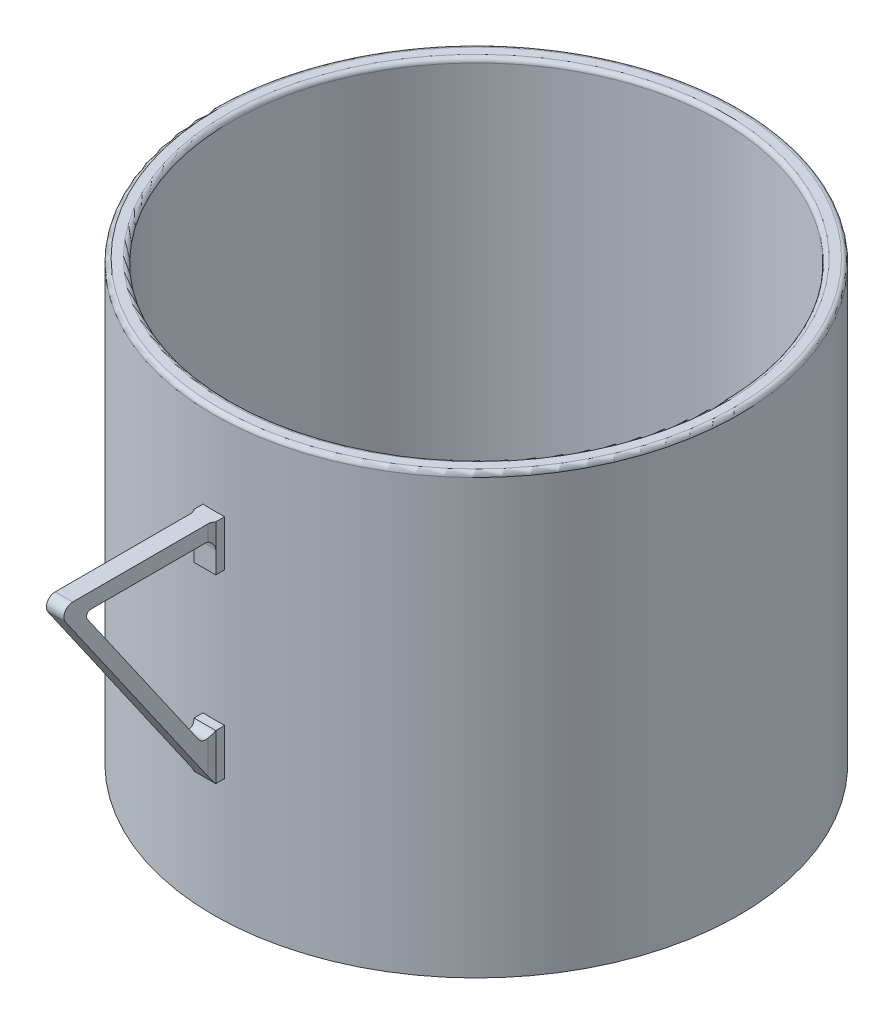
ISO-10303-21;
HEADER;
FILE_DESCRIPTION(('STEP AP214'),'2;1');
FILE_NAME('part.step','',(''),(''),'','','');
FILE_SCHEMA(('AUTOMOTIVE_DESIGN { 1 0 10303 214 1 1 1 1 }'));
ENDSEC;
DATA;
#1=APPLICATION_CONTEXT('core data for automotive mechanical design processes');
#2=APPLICATION_PROTOCOL_DEFINITION('international standard','automotive_design',2000,#1);
#3=PRODUCT_CONTEXT('',#1,'mechanical');
#4=PRODUCT('Part','Part','',(#3));
#5=PRODUCT_RELATED_PRODUCT_CATEGORY('part','',(#4));
#6=PRODUCT_DEFINITION_FORMATION('','',#4);
#7=PRODUCT_DEFINITION_CONTEXT('part definition',#1,'design');
#8=PRODUCT_DEFINITION('design','',#6,#7);
#9=PRODUCT_DEFINITION_SHAPE('','',#8);
#10=(LENGTH_UNIT() NAMED_UNIT(*) SI_UNIT(.MILLI.,.METRE.));
#11=(NAMED_UNIT(*) PLANE_ANGLE_UNIT() SI_UNIT($,.RADIAN.));
#12=(NAMED_UNIT(*) SI_UNIT($,.STERADIAN.) SOLID_ANGLE_UNIT());
#13=UNCERTAINTY_MEASURE_WITH_UNIT(LENGTH_MEASURE(1.E-05),#10,'distance_accuracy_value','');
#14=(GEOMETRIC_REPRESENTATION_CONTEXT(3) GLOBAL_UNCERTAINTY_ASSIGNED_CONTEXT((#13)) GLOBAL_UNIT_ASSIGNED_CONTEXT((#10,
#11,#12)) REPRESENTATION_CONTEXT('',''));
#15=CARTESIAN_POINT('',(0.,0.,0.));
#16=DIRECTION('',(0.,0.,1.));
#17=DIRECTION('',(1.,0.,0.));
#18=AXIS2_PLACEMENT_3D('',#15,#16,#17);
#19=CARTESIAN_POINT('',(0.,100.,0.));
#20=DIRECTION('',(0.,-1.,0.));
#21=DIRECTION('',(0.,0.,-1.));
#22=AXIS2_PLACEMENT_3D('',#19,#20,#21);
#23=CYLINDRICAL_SURFACE('',#22,60.);
#24=CARTESIAN_POINT('',(0.,99.,0.));
#25=DIRECTION('',(0.,1.,0.));
#26=DIRECTION('',(0.,0.,1.));
#27=AXIS2_PLACEMENT_3D('',#24,#25,#26);
#28=CIRCLE('',#27,60.);
#29=CARTESIAN_POINT('',(0.,99.,60.));
#30=VERTEX_POINT('',#29);
#31=EDGE_CURVE('E458',#30,#30,#28,.F.);
#32=ORIENTED_EDGE('',*,*,#31,.T.);
#33=EDGE_LOOP('',(#32));
#34=FACE_BOUND('',#33,.T.);
#35=CARTESIAN_POINT('',(0.,28.2584995098135,0.));
#36=DIRECTION('',(0.,-1.,0.));
#37=DIRECTION('',(0.,0.,-1.));
#38=AXIS2_PLACEMENT_3D('',#35,#36,#37);
#39=CIRCLE('',#38,60.);
#40=CARTESIAN_POINT('',(-2.48057388143072,28.2584995098135,59.9487010136063));
#41=VERTEX_POINT('',#40);
#42=CARTESIAN_POINT('',(2.48057388143072,28.2584995098135,59.9487010136063));
#43=VERTEX_POINT('',#42);
#44=EDGE_CURVE('E184',#41,#43,#39,.F.);
#45=ORIENTED_EDGE('',*,*,#44,.F.);
#46=DIRECTION('',(0.,-1.,0.));
#47=VECTOR('',#46,1.);
#48=CARTESIAN_POINT('',(-2.48057388143072,100.,59.9487010136063));
#49=LINE('',#48,#47);
#50=CARTESIAN_POINT('',(-2.48057388143072,38.764459478226,59.9487010136063));
#51=VERTEX_POINT('',#50);
#52=EDGE_CURVE('E190',#41,#51,#49,.F.);
#53=ORIENTED_EDGE('',*,*,#52,.T.);
#54=CARTESIAN_POINT('',(0.,38.764459478226,0.));
#55=DIRECTION('',(0.,-1.,0.));
#56=DIRECTION('',(0.,0.,-1.));
#57=AXIS2_PLACEMENT_3D('',#54,#55,#56);
#58=CIRCLE('',#57,60.);
#59=CARTESIAN_POINT('',(2.48057388143072,38.764459478226,59.9487010136063));
#60=VERTEX_POINT('',#59);
#61=EDGE_CURVE('E195',#51,#60,#58,.F.);
#62=ORIENTED_EDGE('',*,*,#61,.T.);
#63=DIRECTION('',(0.,-1.,0.));
#64=VECTOR('',#63,1.);
#65=CARTESIAN_POINT('',(2.48057388143072,100.,59.9487010136063));
#66=LINE('',#65,#64);
#67=EDGE_CURVE('E174',#43,#60,#66,.F.);
#68=ORIENTED_EDGE('',*,*,#67,.F.);
#69=EDGE_LOOP('',(#45,#53,#62,#68));
#70=FACE_BOUND('',#69,.T.);
#71=CARTESIAN_POINT('',(0.,0.,0.));
#72=DIRECTION('',(0.,1.,0.));
#73=DIRECTION('',(0.,0.,1.));
#74=AXIS2_PLACEMENT_3D('',#71,#72,#73);
#75=CIRCLE('',#74,60.);
#76=CARTESIAN_POINT('',(0.,0.,60.));
#77=VERTEX_POINT('',#76);
#78=EDGE_CURVE('E250',#77,#77,#75,.T.);
#79=ORIENTED_EDGE('',*,*,#78,.T.);
#80=EDGE_LOOP('',(#79));
#81=FACE_BOUND('',#80,.T.);
#82=CARTESIAN_POINT('',(0.,69.5527588301014,0.));
#83=DIRECTION('',(0.,-1.,0.));
#84=DIRECTION('',(0.,0.,-1.));
#85=AXIS2_PLACEMENT_3D('',#82,#83,#84);
#86=CIRCLE('',#85,60.);
#87=CARTESIAN_POINT('',(-2.48057388143072,69.5527588301014,59.9487010136063));
#88=VERTEX_POINT('',#87);
#89=CARTESIAN_POINT('',(2.48057388143072,69.5527588301014,59.9487010136063));
#90=VERTEX_POINT('',#89);
#91=EDGE_CURVE('E218',#88,#90,#86,.F.);
#92=ORIENTED_EDGE('',*,*,#91,.F.);
#93=DIRECTION('',(0.,-1.,0.));
#94=VECTOR('',#93,1.);
#95=CARTESIAN_POINT('',(-2.48057388143072,100.,59.9487010136063));
#96=LINE('',#95,#94);
#97=CARTESIAN_POINT('',(-2.48057388143072,80.0587187985139,59.9487010136063));
#98=VERTEX_POINT('',#97);
#99=EDGE_CURVE('E221',#88,#98,#96,.F.);
#100=ORIENTED_EDGE('',*,*,#99,.T.);
#101=CARTESIAN_POINT('',(0.,80.0587187985139,0.));
#102=DIRECTION('',(0.,-1.,0.));
#103=DIRECTION('',(0.,0.,-1.));
#104=AXIS2_PLACEMENT_3D('',#101,#102,#103);
#105=CIRCLE('',#104,60.);
#106=CARTESIAN_POINT('',(2.48057388143072,80.0587187985139,59.9487010136063));
#107=VERTEX_POINT('',#106);
#108=EDGE_CURVE('E224',#98,#107,#105,.F.);
#109=ORIENTED_EDGE('',*,*,#108,.T.);
#110=DIRECTION('',(0.,-1.,0.));
#111=VECTOR('',#110,1.);
#112=CARTESIAN_POINT('',(2.48057388143072,100.,59.9487010136063));
#113=LINE('',#112,#111);
#114=EDGE_CURVE('E212',#90,#107,#113,.F.);
#115=ORIENTED_EDGE('',*,*,#114,.F.);
#116=EDGE_LOOP('',(#92,#100,#109,#115));
#117=FACE_BOUND('',#116,.T.);
#118=ADVANCED_FACE('F33',(#34,#70,#81,#117),#23,.T.);
#119=CARTESIAN_POINT('',(0.,100.,0.));
#120=DIRECTION('',(0.,1.,0.));
#121=DIRECTION('',(0.,0.,1.));
#122=AXIS2_PLACEMENT_3D('',#119,#120,#121);
#123=PLANE('',#122);
#124=CARTESIAN_POINT('',(0.,100.,0.));
#125=DIRECTION('',(0.,1.,0.));
#126=DIRECTION('',(0.,0.,1.));
#127=AXIS2_PLACEMENT_3D('',#124,#125,#126);
#128=CIRCLE('',#127,57.);
#129=CARTESIAN_POINT('',(0.,100.,57.));
#130=VERTEX_POINT('',#129);
#131=EDGE_CURVE('E466',#130,#130,#128,.F.);
#132=ORIENTED_EDGE('',*,*,#131,.T.);
#133=EDGE_LOOP('',(#132));
#134=FACE_BOUND('',#133,.T.);
#135=CARTESIAN_POINT('',(0.,100.,0.));
#136=DIRECTION('',(0.,1.,0.));
#137=DIRECTION('',(0.,0.,1.));
#138=AXIS2_PLACEMENT_3D('',#135,#136,#137);
#139=CIRCLE('',#138,59.);
#140=CARTESIAN_POINT('',(0.,100.,59.));
#141=VERTEX_POINT('',#140);
#142=EDGE_CURVE('E453',#141,#141,#139,.T.);
#143=ORIENTED_EDGE('',*,*,#142,.T.);
#144=EDGE_LOOP('',(#143));
#145=FACE_BOUND('',#144,.T.);
#146=ADVANCED_FACE('F357',(#134,#145),#123,.T.);
#147=CARTESIAN_POINT('',(0.,0.,0.));
#148=DIRECTION('',(0.,1.,0.));
#149=DIRECTION('',(0.,0.,1.));
#150=AXIS2_PLACEMENT_3D('',#147,#148,#149);
#151=PLANE('',#150);
#152=ORIENTED_EDGE('',*,*,#78,.F.);
#153=EDGE_LOOP('',(#152));
#154=FACE_BOUND('',#153,.T.);
#155=ADVANCED_FACE('F363',(#154),#151,.F.);
#156=CARTESIAN_POINT('',(0.,100.,0.));
#157=DIRECTION('',(0.,-1.,0.));
#158=DIRECTION('',(0.,0.,-1.));
#159=AXIS2_PLACEMENT_3D('',#156,#157,#158);
#160=CYLINDRICAL_SURFACE('',#159,56.);
#161=CARTESIAN_POINT('',(0.,99.,0.));
#162=DIRECTION('',(0.,1.,0.));
#163=DIRECTION('',(0.,0.,1.));
#164=AXIS2_PLACEMENT_3D('',#161,#162,#163);
#165=CIRCLE('',#164,56.);
#166=CARTESIAN_POINT('',(0.,99.,56.));
#167=VERTEX_POINT('',#166);
#168=EDGE_CURVE('E461',#167,#167,#165,.T.);
#169=ORIENTED_EDGE('',*,*,#168,.T.);
#170=EDGE_LOOP('',(#169));
#171=FACE_BOUND('',#170,.T.);
#172=CARTESIAN_POINT('',(0.,4.,0.));
#173=DIRECTION('',(0.,1.,0.));
#174=DIRECTION('',(0.,0.,1.));
#175=AXIS2_PLACEMENT_3D('',#172,#173,#174);
#176=CIRCLE('',#175,56.);
#177=CARTESIAN_POINT('',(0.,4.,56.));
#178=VERTEX_POINT('',#177);
#179=EDGE_CURVE('E247',#178,#178,#176,.T.);
#180=ORIENTED_EDGE('',*,*,#179,.F.);
#181=EDGE_LOOP('',(#180));
#182=FACE_BOUND('',#181,.T.);
#183=ADVANCED_FACE('F472',(#171,#182),#160,.F.);
#184=CARTESIAN_POINT('',(0.,4.,0.));
#185=DIRECTION('',(0.,1.,0.));
#186=DIRECTION('',(0.,0.,1.));
#187=AXIS2_PLACEMENT_3D('',#184,#185,#186);
#188=PLANE('',#187);
#189=ORIENTED_EDGE('',*,*,#179,.T.);
#190=EDGE_LOOP('',(#189));
#191=FACE_BOUND('',#190,.T.);
#192=ADVANCED_FACE('F475',(#191),#188,.T.);
#193=CARTESIAN_POINT('',(-2.48057388143072,69.5527588301014,62.));
#194=DIRECTION('',(0.,1.,0.));
#195=DIRECTION('',(0.,0.,1.));
#196=AXIS2_PLACEMENT_3D('',#193,#194,#195);
#197=PLANE('',#196);
#198=DIRECTION('',(0.,0.,-1.));
#199=VECTOR('',#198,1.);
#200=CARTESIAN_POINT('',(-2.48057388143072,69.5527588301014,62.));
#201=LINE('',#200,#199);
#202=CARTESIAN_POINT('',(-2.48057388143072,69.5527588301014,62.));
#203=VERTEX_POINT('',#202);
#204=EDGE_CURVE('E238',#203,#88,#201,.T.);
#205=ORIENTED_EDGE('',*,*,#204,.T.);
#206=ORIENTED_EDGE('',*,*,#91,.T.);
#207=DIRECTION('',(0.,0.,-1.));
#208=VECTOR('',#207,1.);
#209=CARTESIAN_POINT('',(2.48057388143072,69.5527588301014,62.));
#210=LINE('',#209,#208);
#211=CARTESIAN_POINT('',(2.48057388143072,69.5527588301014,62.));
#212=VERTEX_POINT('',#211);
#213=EDGE_CURVE('E245',#212,#90,#210,.T.);
#214=ORIENTED_EDGE('',*,*,#213,.F.);
#215=DIRECTION('',(1.,0.,0.));
#216=VECTOR('',#215,1.);
#217=CARTESIAN_POINT('',(-2.48057388143072,69.5527588301014,62.));
#218=LINE('',#217,#216);
#219=EDGE_CURVE('E227',#203,#212,#218,.T.);
#220=ORIENTED_EDGE('',*,*,#219,.F.);
#221=EDGE_LOOP('',(#205,#206,#214,#220));
#222=FACE_BOUND('',#221,.T.);
#223=ADVANCED_FACE('F480',(#222),#197,.F.);
#224=CARTESIAN_POINT('',(2.48057388143072,69.5527588301014,62.));
#225=DIRECTION('',(-1.,0.,0.));
#226=DIRECTION('',(0.,0.,1.));
#227=AXIS2_PLACEMENT_3D('',#224,#225,#226);
#228=PLANE('',#227);
#229=ORIENTED_EDGE('',*,*,#213,.T.);
#230=ORIENTED_EDGE('',*,*,#114,.T.);
#231=DIRECTION('',(0.,0.,-1.));
#232=VECTOR('',#231,1.);
#233=CARTESIAN_POINT('',(2.48057388143072,80.0587187985139,62.));
#234=LINE('',#233,#232);
#235=CARTESIAN_POINT('',(2.48057388143072,80.0587187985139,62.));
#236=VERTEX_POINT('',#235);
#237=EDGE_CURVE('E243',#236,#107,#234,.T.);
#238=ORIENTED_EDGE('',*,*,#237,.F.);
#239=DIRECTION('',(0.,1.,0.));
#240=VECTOR('',#239,1.);
#241=CARTESIAN_POINT('',(2.48057388143072,69.5527588301014,62.));
#242=LINE('',#241,#240);
#243=CARTESIAN_POINT('',(2.48057388143072,74.5587187985139,62.));
#244=VERTEX_POINT('',#243);
#245=EDGE_CURVE('E230',#244,#236,#242,.T.);
#246=ORIENTED_EDGE('',*,*,#245,.F.);
#247=EDGE_CURVE('E231',#212,#244,#242,.T.);
#248=ORIENTED_EDGE('',*,*,#247,.F.);
#249=EDGE_LOOP('',(#229,#230,#238,#246,#248));
#250=FACE_BOUND('',#249,.T.);
#251=ADVANCED_FACE('F485',(#250),#228,.F.);
#252=CARTESIAN_POINT('',(-2.48057388143072,80.0587187985139,62.));
#253=DIRECTION('',(0.,1.,0.));
#254=DIRECTION('',(0.,0.,1.));
#255=AXIS2_PLACEMENT_3D('',#252,#253,#254);
#256=PLANE('',#255);
#257=DIRECTION('',(0.,0.,-1.));
#258=VECTOR('',#257,1.);
#259=CARTESIAN_POINT('',(-2.48057388143072,80.0587187985139,62.));
#260=LINE('',#259,#258);
#261=CARTESIAN_POINT('',(-2.48057388143072,80.0587187985139,62.));
#262=VERTEX_POINT('',#261);
#263=EDGE_CURVE('E240',#262,#98,#260,.T.);
#264=ORIENTED_EDGE('',*,*,#263,.F.);
#265=CARTESIAN_POINT('',(-4.,80.0587187985139,63.3005169242303));
#266=DIRECTION('',(0.,1.,0.));
#267=DIRECTION('',(0.,0.,1.));
#268=AXIS2_PLACEMENT_3D('',#265,#266,#267);
#269=CIRCLE('',#268,2.);
#270=CARTESIAN_POINT('',(-2.,80.0587187985139,63.3005169242303));
#271=VERTEX_POINT('',#270);
#272=EDGE_CURVE('E266',#262,#271,#269,.F.);
#273=ORIENTED_EDGE('',*,*,#272,.T.);
#274=DIRECTION('',(0.,0.,1.));
#275=VECTOR('',#274,1.);
#276=CARTESIAN_POINT('',(-2.,80.0587187985139,62.));
#277=LINE('',#276,#275);
#278=CARTESIAN_POINT('',(-2.,80.0587187985139,94.2108069435803));
#279=VERTEX_POINT('',#278);
#280=EDGE_CURVE('E319',#271,#279,#277,.T.);
#281=ORIENTED_EDGE('',*,*,#280,.T.);
#282=DIRECTION('',(-1.,0.,0.));
#283=VECTOR('',#282,1.);
#284=CARTESIAN_POINT('',(2.,80.0587187985139,94.2108069435803));
#285=LINE('',#284,#283);
#286=CARTESIAN_POINT('',(2.,80.0587187985139,94.2108069435803));
#287=VERTEX_POINT('',#286);
#288=EDGE_CURVE('E259',#279,#287,#285,.F.);
#289=ORIENTED_EDGE('',*,*,#288,.T.);
#290=DIRECTION('',(0.,0.,1.));
#291=VECTOR('',#290,1.);
#292=CARTESIAN_POINT('',(2.,80.0587187985139,62.));
#293=LINE('',#292,#291);
#294=CARTESIAN_POINT('',(2.,80.0587187985139,63.3005169242303));
#295=VERTEX_POINT('',#294);
#296=EDGE_CURVE('E388',#295,#287,#293,.T.);
#297=ORIENTED_EDGE('',*,*,#296,.F.);
#298=CARTESIAN_POINT('',(4.,80.0587187985139,63.3005169242303));
#299=DIRECTION('',(0.,1.,0.));
#300=DIRECTION('',(0.,0.,1.));
#301=AXIS2_PLACEMENT_3D('',#298,#299,#300);
#302=CIRCLE('',#301,2.);
#303=EDGE_CURVE('E321',#295,#236,#302,.F.);
#304=ORIENTED_EDGE('',*,*,#303,.T.);
#305=ORIENTED_EDGE('',*,*,#237,.T.);
#306=ORIENTED_EDGE('',*,*,#108,.F.);
#307=EDGE_LOOP('',(#264,#273,#281,#289,#297,#304,#305,#306));
#308=FACE_BOUND('',#307,.T.);
#309=ADVANCED_FACE('F491',(#308),#256,.T.);
#310=CARTESIAN_POINT('',(-2.48057388143072,69.5527588301014,62.));
#311=DIRECTION('',(-1.,0.,0.));
#312=DIRECTION('',(0.,0.,1.));
#313=AXIS2_PLACEMENT_3D('',#310,#311,#312);
#314=PLANE('',#313);
#315=ORIENTED_EDGE('',*,*,#263,.T.);
#316=ORIENTED_EDGE('',*,*,#99,.F.);
#317=ORIENTED_EDGE('',*,*,#204,.F.);
#318=DIRECTION('',(0.,1.,0.));
#319=VECTOR('',#318,1.);
#320=CARTESIAN_POINT('',(-2.48057388143072,69.5527588301014,62.));
#321=LINE('',#320,#319);
#322=CARTESIAN_POINT('',(-2.48057388143072,74.5587187985139,62.));
#323=VERTEX_POINT('',#322);
#324=EDGE_CURVE('E235',#203,#323,#321,.T.);
#325=ORIENTED_EDGE('',*,*,#324,.T.);
#326=EDGE_CURVE('E234',#323,#262,#321,.T.);
#327=ORIENTED_EDGE('',*,*,#326,.T.);
#328=EDGE_LOOP('',(#315,#316,#317,#325,#327));
#329=FACE_BOUND('',#328,.T.);
#330=ADVANCED_FACE('F495',(#329),#314,.T.);
#331=CARTESIAN_POINT('',(0.,0.,62.));
#332=DIRECTION('',(0.,0.,1.));
#333=DIRECTION('',(1.,0.,0.));
#334=AXIS2_PLACEMENT_3D('',#331,#332,#333);
#335=PLANE('',#334);
#336=ORIENTED_EDGE('',*,*,#247,.T.);
#337=DIRECTION('',(-1.,0.,0.));
#338=VECTOR('',#337,1.);
#339=CARTESIAN_POINT('',(0.,74.5587187985139,62.));
#340=LINE('',#339,#338);
#341=EDGE_CURVE('E268',#244,#323,#340,.T.);
#342=ORIENTED_EDGE('',*,*,#341,.T.);
#343=ORIENTED_EDGE('',*,*,#324,.F.);
#344=ORIENTED_EDGE('',*,*,#219,.T.);
#345=EDGE_LOOP('',(#336,#342,#343,#344));
#346=FACE_BOUND('',#345,.T.);
#347=ADVANCED_FACE('F498',(#346),#335,.T.);
#348=CARTESIAN_POINT('',(-2.48057388143072,28.2584995098135,62.));
#349=DIRECTION('',(-1.,0.,0.));
#350=DIRECTION('',(0.,0.,1.));
#351=AXIS2_PLACEMENT_3D('',#348,#349,#350);
#352=PLANE('',#351);
#353=DIRECTION('',(0.,0.,-1.));
#354=VECTOR('',#353,1.);
#355=CARTESIAN_POINT('',(-2.48057388143072,38.764459478226,62.));
#356=LINE('',#355,#354);
#357=CARTESIAN_POINT('',(-2.48057388143072,38.764459478226,62.));
#358=VERTEX_POINT('',#357);
#359=EDGE_CURVE('E211',#358,#51,#356,.T.);
#360=ORIENTED_EDGE('',*,*,#359,.T.);
#361=ORIENTED_EDGE('',*,*,#52,.F.);
#362=DIRECTION('',(0.,0.,-1.));
#363=VECTOR('',#362,1.);
#364=CARTESIAN_POINT('',(-2.48057388143072,28.2584995098135,62.));
#365=LINE('',#364,#363);
#366=CARTESIAN_POINT('',(-2.48057388143072,28.2584995098135,62.));
#367=VERTEX_POINT('',#366);
#368=EDGE_CURVE('E180',#367,#41,#365,.T.);
#369=ORIENTED_EDGE('',*,*,#368,.F.);
#370=DIRECTION('',(0.,1.,0.));
#371=VECTOR('',#370,1.);
#372=CARTESIAN_POINT('',(-2.48057388143072,28.2584995098135,62.));
#373=LINE('',#372,#371);
#374=EDGE_CURVE('E203',#367,#358,#373,.T.);
#375=ORIENTED_EDGE('',*,*,#374,.T.);
#376=EDGE_LOOP('',(#360,#361,#369,#375));
#377=FACE_BOUND('',#376,.T.);
#378=ADVANCED_FACE('F502',(#377),#352,.T.);
#379=CARTESIAN_POINT('',(-2.48057388143072,28.2584995098135,62.));
#380=DIRECTION('',(0.,1.,0.));
#381=DIRECTION('',(0.,0.,1.));
#382=AXIS2_PLACEMENT_3D('',#379,#380,#381);
#383=PLANE('',#382);
#384=ORIENTED_EDGE('',*,*,#368,.T.);
#385=ORIENTED_EDGE('',*,*,#44,.T.);
#386=DIRECTION('',(0.,0.,-1.));
#387=VECTOR('',#386,1.);
#388=CARTESIAN_POINT('',(2.48057388143072,28.2584995098135,62.));
#389=LINE('',#388,#387);
#390=CARTESIAN_POINT('',(2.48057388143072,28.2584995098135,62.));
#391=VERTEX_POINT('',#390);
#392=EDGE_CURVE('E170',#391,#43,#389,.T.);
#393=ORIENTED_EDGE('',*,*,#392,.F.);
#394=DIRECTION('',(-1.,0.,0.));
#395=VECTOR('',#394,1.);
#396=CARTESIAN_POINT('',(2.,28.2584995098135,62.));
#397=LINE('',#396,#395);
#398=EDGE_CURVE('E196',#391,#367,#397,.T.);
#399=ORIENTED_EDGE('',*,*,#398,.T.);
#400=EDGE_LOOP('',(#384,#385,#393,#399));
#401=FACE_BOUND('',#400,.T.);
#402=ADVANCED_FACE('F185',(#401),#383,.F.);
#403=CARTESIAN_POINT('',(2.48057388143072,28.2584995098135,62.));
#404=DIRECTION('',(-1.,0.,0.));
#405=DIRECTION('',(0.,0.,1.));
#406=AXIS2_PLACEMENT_3D('',#403,#404,#405);
#407=PLANE('',#406);
#408=ORIENTED_EDGE('',*,*,#392,.T.);
#409=ORIENTED_EDGE('',*,*,#67,.T.);
#410=DIRECTION('',(0.,0.,-1.));
#411=VECTOR('',#410,1.);
#412=CARTESIAN_POINT('',(2.48057388143072,38.764459478226,62.));
#413=LINE('',#412,#411);
#414=CARTESIAN_POINT('',(2.48057388143072,38.764459478226,62.));
#415=VERTEX_POINT('',#414);
#416=EDGE_CURVE('E181',#415,#60,#413,.T.);
#417=ORIENTED_EDGE('',*,*,#416,.F.);
#418=DIRECTION('',(0.,1.,0.));
#419=VECTOR('',#418,1.);
#420=CARTESIAN_POINT('',(2.48057388143072,28.2584995098135,62.));
#421=LINE('',#420,#419);
#422=EDGE_CURVE('E177',#391,#415,#421,.T.);
#423=ORIENTED_EDGE('',*,*,#422,.F.);
#424=EDGE_LOOP('',(#408,#409,#417,#423));
#425=FACE_BOUND('',#424,.T.);
#426=ADVANCED_FACE('F172',(#425),#407,.F.);
#427=CARTESIAN_POINT('',(-2.48057388143072,38.764459478226,62.));
#428=DIRECTION('',(0.,1.,0.));
#429=DIRECTION('',(0.,0.,1.));
#430=AXIS2_PLACEMENT_3D('',#427,#428,#429);
#431=PLANE('',#430);
#432=ORIENTED_EDGE('',*,*,#416,.T.);
#433=ORIENTED_EDGE('',*,*,#61,.F.);
#434=ORIENTED_EDGE('',*,*,#359,.F.);
#435=DIRECTION('',(1.,0.,0.));
#436=VECTOR('',#435,1.);
#437=CARTESIAN_POINT('',(-2.48057388143072,38.764459478226,62.));
#438=LINE('',#437,#436);
#439=EDGE_CURVE('E207',#358,#415,#438,.T.);
#440=ORIENTED_EDGE('',*,*,#439,.T.);
#441=EDGE_LOOP('',(#432,#433,#434,#440));
#442=FACE_BOUND('',#441,.T.);
#443=ADVANCED_FACE('F507',(#442),#431,.T.);
#444=CARTESIAN_POINT('',(2.,80.0587187985139,98.0386729313277));
#445=DIRECTION('',(0.,0.571104403409088,-0.820877433242472));
#446=DIRECTION('',(0.,0.820877433242472,0.571104403409088));
#447=AXIS2_PLACEMENT_3D('',#444,#445,#446);
#448=PLANE('',#447);
#449=DIRECTION('',(0.,-0.820877433242472,-0.571104403409088));
#450=VECTOR('',#449,1.);
#451=CARTESIAN_POINT('',(2.,80.0587187985139,98.0386729313277));
#452=LINE('',#451,#450);
#453=CARTESIAN_POINT('',(2.,76.9165099916957,95.8525618100653));
#454=VERTEX_POINT('',#453);
#455=CARTESIAN_POINT('',(2.,30.1277986927264,63.3005169242303));
#456=VERTEX_POINT('',#455);
#457=EDGE_CURVE('E385',#454,#456,#452,.T.);
#458=ORIENTED_EDGE('',*,*,#457,.F.);
#459=DIRECTION('',(-1.,0.,0.));
#460=VECTOR('',#459,1.);
#461=CARTESIAN_POINT('',(-2.,76.9165099916957,95.8525618100653));
#462=LINE('',#461,#460);
#463=CARTESIAN_POINT('',(-2.,76.9165099916957,95.8525618100653));
#464=VERTEX_POINT('',#463);
#465=EDGE_CURVE('E253',#454,#464,#462,.T.);
#466=ORIENTED_EDGE('',*,*,#465,.T.);
#467=DIRECTION('',(0.,-0.820877433242472,-0.571104403409088));
#468=VECTOR('',#467,1.);
#469=CARTESIAN_POINT('',(-2.,80.0587187985139,98.0386729313277));
#470=LINE('',#469,#468);
#471=CARTESIAN_POINT('',(-2.,30.1277986927264,63.3005169242303));
#472=VERTEX_POINT('',#471);
#473=EDGE_CURVE('E402',#464,#472,#470,.T.);
#474=ORIENTED_EDGE('',*,*,#473,.T.);
#475=CARTESIAN_POINT('',(-4.,30.1277986927264,63.3005169242303));
#476=DIRECTION('',(0.,0.571104403409088,-0.820877433242472));
#477=DIRECTION('',(0.,0.820877433242472,0.571104403409088));
#478=AXIS2_PLACEMENT_3D('',#475,#476,#477);
#479=ELLIPSE('',#478,3.50198665613751,2.);
#480=EDGE_CURVE('E444',#472,#367,#479,.T.);
#481=ORIENTED_EDGE('',*,*,#480,.T.);
#482=ORIENTED_EDGE('',*,*,#398,.F.);
#483=CARTESIAN_POINT('',(4.,30.1277986927264,63.3005169242303));
#484=DIRECTION('',(0.,0.571104403409088,-0.820877433242472));
#485=DIRECTION('',(0.,0.820877433242472,0.571104403409088));
#486=AXIS2_PLACEMENT_3D('',#483,#484,#485);
#487=ELLIPSE('',#486,3.50198665613751,2.);
#488=EDGE_CURVE('E393',#391,#456,#487,.T.);
#489=ORIENTED_EDGE('',*,*,#488,.T.);
#490=EDGE_LOOP('',(#458,#466,#474,#481,#482,#489));
#491=FACE_BOUND('',#490,.T.);
#492=ADVANCED_FACE('F390',(#491),#448,.F.);
#493=CARTESIAN_POINT('',(2.,33.5114794940197,62.));
#494=DIRECTION('',(0.,-0.571104403409089,0.820877433242472));
#495=DIRECTION('',(0.,-0.820877433242472,-0.571104403409089));
#496=AXIS2_PLACEMENT_3D('',#493,#494,#495);
#497=PLANE('',#496);
#498=DIRECTION('',(0.,0.820877433242472,0.571104403409089));
#499=VECTOR('',#498,1.);
#500=CARTESIAN_POINT('',(-2.,33.5114794940197,62.));
#501=LINE('',#500,#499);
#502=CARTESIAN_POINT('',(-2.,38.4729476891614,65.4518141428583));
#503=VERTEX_POINT('',#502);
#504=CARTESIAN_POINT('',(-2.,74.9876143951048,90.8559562233724));
#505=VERTEX_POINT('',#504);
#506=EDGE_CURVE('E404',#503,#505,#501,.T.);
#507=ORIENTED_EDGE('',*,*,#506,.T.);
#508=DIRECTION('',(-1.,0.,0.));
#509=VECTOR('',#508,1.);
#510=CARTESIAN_POINT('',(2.,74.9876143951048,90.8559562233724));
#511=LINE('',#510,#509);
#512=CARTESIAN_POINT('',(2.,74.9876143951048,90.8559562233724));
#513=VERTEX_POINT('',#512);
#514=EDGE_CURVE('E54',#505,#513,#511,.F.);
#515=ORIENTED_EDGE('',*,*,#514,.T.);
#516=DIRECTION('',(0.,0.820877433242472,0.571104403409089));
#517=VECTOR('',#516,1.);
#518=CARTESIAN_POINT('',(2.,33.5114794940197,62.));
#519=LINE('',#518,#517);
#520=CARTESIAN_POINT('',(2.,38.4729476891614,65.4518141428583));
#521=VERTEX_POINT('',#520);
#522=EDGE_CURVE('E394',#521,#513,#519,.T.);
#523=ORIENTED_EDGE('',*,*,#522,.F.);
#524=DIRECTION('',(1.,0.,0.));
#525=VECTOR('',#524,1.);
#526=CARTESIAN_POINT('',(2.,38.4729476891614,65.4518141428583));
#527=LINE('',#526,#525);
#528=EDGE_CURVE('E274',#521,#503,#527,.F.);
#529=ORIENTED_EDGE('',*,*,#528,.T.);
#530=EDGE_LOOP('',(#507,#515,#523,#529));
#531=FACE_BOUND('',#530,.T.);
#532=ADVANCED_FACE('F516',(#531),#497,.F.);
#533=CARTESIAN_POINT('',(2.,76.5587187985139,91.9490117840036));
#534=DIRECTION('',(0.,1.,0.));
#535=DIRECTION('',(0.,0.,1.));
#536=AXIS2_PLACEMENT_3D('',#533,#534,#535);
#537=PLANE('',#536);
#538=DIRECTION('',(0.,0.,-1.));
#539=VECTOR('',#538,1.);
#540=CARTESIAN_POINT('',(2.,76.5587187985139,91.9490117840036));
#541=LINE('',#540,#539);
#542=CARTESIAN_POINT('',(2.,76.5587187985139,90.03507879013));
#543=VERTEX_POINT('',#542);
#544=CARTESIAN_POINT('',(2.,76.5587187985139,64.));
#545=VERTEX_POINT('',#544);
#546=EDGE_CURVE('E198',#543,#545,#541,.T.);
#547=ORIENTED_EDGE('',*,*,#546,.F.);
#548=DIRECTION('',(-1.,0.,0.));
#549=VECTOR('',#548,1.);
#550=CARTESIAN_POINT('',(-2.,76.5587187985139,90.03507879013));
#551=LINE('',#550,#549);
#552=CARTESIAN_POINT('',(-2.,76.5587187985139,90.03507879013));
#553=VERTEX_POINT('',#552);
#554=EDGE_CURVE('E413',#543,#553,#551,.T.);
#555=ORIENTED_EDGE('',*,*,#554,.T.);
#556=DIRECTION('',(0.,0.,-1.));
#557=VECTOR('',#556,1.);
#558=CARTESIAN_POINT('',(-2.,76.5587187985139,91.9490117840036));
#559=LINE('',#558,#557);
#560=CARTESIAN_POINT('',(-2.,76.5587187985139,64.));
#561=VERTEX_POINT('',#560);
#562=EDGE_CURVE('E397',#553,#561,#559,.T.);
#563=ORIENTED_EDGE('',*,*,#562,.T.);
#564=DIRECTION('',(-1.,0.,0.));
#565=VECTOR('',#564,1.);
#566=CARTESIAN_POINT('',(2.,76.5587187985139,64.));
#567=LINE('',#566,#565);
#568=EDGE_CURVE('E271',#561,#545,#567,.F.);
#569=ORIENTED_EDGE('',*,*,#568,.T.);
#570=EDGE_LOOP('',(#547,#555,#563,#569));
#571=FACE_BOUND('',#570,.T.);
#572=ADVANCED_FACE('F409',(#571),#537,.F.);
#573=CARTESIAN_POINT('',(2.,0.,0.));
#574=DIRECTION('',(1.,0.,0.));
#575=DIRECTION('',(0.,0.,-1.));
#576=AXIS2_PLACEMENT_3D('',#573,#574,#575);
#577=PLANE('',#576);
#578=ORIENTED_EDGE('',*,*,#457,.T.);
#579=DIRECTION('',(0.,-1.,0.));
#580=VECTOR('',#579,1.);
#581=CARTESIAN_POINT('',(2.,33.5114794940197,63.3005169242303));
#582=LINE('',#581,#580);
#583=CARTESIAN_POINT('',(2.,35.3807786769326,63.3005169242303));
#584=VERTEX_POINT('',#583);
#585=EDGE_CURVE('E279',#456,#584,#582,.F.);
#586=ORIENTED_EDGE('',*,*,#585,.T.);
#587=CARTESIAN_POINT('',(2.,35.3807786769326,63.3005169242303));
#588=CARTESIAN_POINT('',(2.,37.6811537577776,63.3005169242303));
#589=B_SPLINE_CURVE_WITH_KNOTS('',1,(#587,#588),.UNSPECIFIED.,.F.,.F.,(2,2),(0.,1.),.UNSPECIFIED.);
#590=CARTESIAN_POINT('',(2.,37.6811537577776,63.3005169242303));
#591=VERTEX_POINT('',#590);
#592=EDGE_CURVE('E427',#584,#591,#589,.T.);
#593=ORIENTED_EDGE('',*,*,#592,.T.);
#594=CARTESIAN_POINT('',(2.,39.6151564959796,63.8100592763733));
#595=DIRECTION('',(1.,0.,0.));
#596=DIRECTION('',(0.,0.,-1.));
#597=AXIS2_PLACEMENT_3D('',#594,#595,#596);
#598=CIRCLE('',#597,2.);
#599=EDGE_CURVE('E423',#591,#521,#598,.F.);
#600=ORIENTED_EDGE('',*,*,#599,.T.);
#601=ORIENTED_EDGE('',*,*,#522,.T.);
#602=CARTESIAN_POINT('',(2.,75.5587187985139,90.03507879013));
#603=DIRECTION('',(1.,0.,0.));
#604=DIRECTION('',(0.,0.,-1.));
#605=AXIS2_PLACEMENT_3D('',#602,#603,#604);
#606=CIRCLE('',#605,1.);
#607=EDGE_CURVE('E11',#513,#543,#606,.F.);
#608=ORIENTED_EDGE('',*,*,#607,.T.);
#609=ORIENTED_EDGE('',*,*,#546,.T.);
#610=CARTESIAN_POINT('',(2.,74.5587187985139,64.));
#611=DIRECTION('',(1.,0.,0.));
#612=DIRECTION('',(0.,0.,-1.));
#613=AXIS2_PLACEMENT_3D('',#610,#611,#612);
#614=CIRCLE('',#613,2.);
#615=CARTESIAN_POINT('',(2.,76.4324112563927,63.3005169242303));
#616=VERTEX_POINT('',#615);
#617=EDGE_CURVE('E418',#545,#616,#614,.F.);
#618=ORIENTED_EDGE('',*,*,#617,.T.);
#619=DIRECTION('',(0.,1.,0.));
#620=VECTOR('',#619,1.);
#621=CARTESIAN_POINT('',(2.,80.0587187985139,63.3005169242303));
#622=LINE('',#621,#620);
#623=EDGE_CURVE('E277',#616,#295,#622,.T.);
#624=ORIENTED_EDGE('',*,*,#623,.T.);
#625=ORIENTED_EDGE('',*,*,#296,.T.);
#626=CARTESIAN_POINT('',(2.,78.0587187985139,94.2108069435803));
#627=DIRECTION('',(1.,0.,0.));
#628=DIRECTION('',(0.,0.,-1.));
#629=AXIS2_PLACEMENT_3D('',#626,#627,#628);
#630=CIRCLE('',#629,2.);
#631=EDGE_CURVE('E262',#287,#454,#630,.T.);
#632=ORIENTED_EDGE('',*,*,#631,.T.);
#633=EDGE_LOOP('',(#578,#586,#593,#600,#601,#608,#609,#618,#624,#625,#632));
#634=FACE_BOUND('',#633,.T.);
#635=ADVANCED_FACE('F377',(#634),#577,.T.);
#636=CARTESIAN_POINT('',(-2.,0.,0.));
#637=DIRECTION('',(1.,0.,0.));
#638=DIRECTION('',(0.,0.,-1.));
#639=AXIS2_PLACEMENT_3D('',#636,#637,#638);
#640=PLANE('',#639);
#641=CARTESIAN_POINT('',(-2.,39.6151564959796,63.8100592763733));
#642=DIRECTION('',(1.,0.,0.));
#643=DIRECTION('',(0.,0.,-1.));
#644=AXIS2_PLACEMENT_3D('',#641,#642,#643);
#645=CIRCLE('',#644,2.);
#646=CARTESIAN_POINT('',(-2.,37.6811537577776,63.3005169242303));
#647=VERTEX_POINT('',#646);
#648=EDGE_CURVE('E422',#503,#647,#645,.T.);
#649=ORIENTED_EDGE('',*,*,#648,.T.);
#650=CARTESIAN_POINT('',(-2.,37.6811537577776,63.3005169242303));
#651=CARTESIAN_POINT('',(-2.,35.3807786769326,63.3005169242303));
#652=B_SPLINE_CURVE_WITH_KNOTS('',1,(#650,#651),.UNSPECIFIED.,.F.,.F.,(2,2),(0.,1.),.UNSPECIFIED.);
#653=CARTESIAN_POINT('',(-2.,35.3807786769326,63.3005169242303));
#654=VERTEX_POINT('',#653);
#655=EDGE_CURVE('E442',#647,#654,#652,.T.);
#656=ORIENTED_EDGE('',*,*,#655,.T.);
#657=DIRECTION('',(0.,1.,0.));
#658=VECTOR('',#657,1.);
#659=CARTESIAN_POINT('',(-2.,0.,63.3005169242303));
#660=LINE('',#659,#658);
#661=EDGE_CURVE('E281',#654,#472,#660,.F.);
#662=ORIENTED_EDGE('',*,*,#661,.T.);
#663=ORIENTED_EDGE('',*,*,#473,.F.);
#664=CARTESIAN_POINT('',(-2.,78.0587187985139,94.2108069435803));
#665=DIRECTION('',(1.,0.,0.));
#666=DIRECTION('',(0.,0.,-1.));
#667=AXIS2_PLACEMENT_3D('',#664,#665,#666);
#668=CIRCLE('',#667,2.);
#669=EDGE_CURVE('E256',#464,#279,#668,.F.);
#670=ORIENTED_EDGE('',*,*,#669,.T.);
#671=ORIENTED_EDGE('',*,*,#280,.F.);
#672=DIRECTION('',(0.,-1.,0.));
#673=VECTOR('',#672,1.);
#674=CARTESIAN_POINT('',(-2.,0.,63.3005169242303));
#675=LINE('',#674,#673);
#676=CARTESIAN_POINT('',(-2.,76.4324112563928,63.3005169242303));
#677=VERTEX_POINT('',#676);
#678=EDGE_CURVE('E264',#271,#677,#675,.T.);
#679=ORIENTED_EDGE('',*,*,#678,.T.);
#680=CARTESIAN_POINT('',(-2.,74.5587187985139,64.));
#681=DIRECTION('',(1.,0.,0.));
#682=DIRECTION('',(0.,0.,-1.));
#683=AXIS2_PLACEMENT_3D('',#680,#681,#682);
#684=CIRCLE('',#683,2.);
#685=EDGE_CURVE('E292',#677,#561,#684,.T.);
#686=ORIENTED_EDGE('',*,*,#685,.T.);
#687=ORIENTED_EDGE('',*,*,#562,.F.);
#688=CARTESIAN_POINT('',(-2.,75.5587187985139,90.03507879013));
#689=DIRECTION('',(1.,0.,0.));
#690=DIRECTION('',(0.,0.,-1.));
#691=AXIS2_PLACEMENT_3D('',#688,#689,#690);
#692=CIRCLE('',#691,1.);
#693=EDGE_CURVE('E41',#553,#505,#692,.T.);
#694=ORIENTED_EDGE('',*,*,#693,.T.);
#695=ORIENTED_EDGE('',*,*,#506,.F.);
#696=EDGE_LOOP('',(#649,#656,#662,#663,#670,#671,#679,#686,#687,#694,#695));
#697=FACE_BOUND('',#696,.T.);
#698=ADVANCED_FACE('F370',(#697),#640,.F.);
#699=CARTESIAN_POINT('',(2.,78.0587187985139,94.2108069435803));
#700=DIRECTION('',(1.,0.,0.));
#701=DIRECTION('',(0.,0.,-1.));
#702=AXIS2_PLACEMENT_3D('',#699,#700,#701);
#703=CYLINDRICAL_SURFACE('',#702,2.);
#704=ORIENTED_EDGE('',*,*,#631,.F.);
#705=ORIENTED_EDGE('',*,*,#288,.F.);
#706=ORIENTED_EDGE('',*,*,#669,.F.);
#707=ORIENTED_EDGE('',*,*,#465,.F.);
#708=EDGE_LOOP('',(#704,#705,#706,#707));
#709=FACE_BOUND('',#708,.T.);
#710=ADVANCED_FACE('F368',(#709),#703,.T.);
#711=CARTESIAN_POINT('',(-4.,0.,63.3005169242303));
#712=DIRECTION('',(0.,-1.,0.));
#713=DIRECTION('',(0.,0.,-1.));
#714=AXIS2_PLACEMENT_3D('',#711,#712,#713);
#715=CYLINDRICAL_SURFACE('',#714,2.);
#716=ORIENTED_EDGE('',*,*,#326,.F.);
#717=CARTESIAN_POINT('',(-2.48057388143072,74.5587187985139,62.));
#718=CARTESIAN_POINT('',(-2.48060979680032,74.6094494053008,61.9999868658527));
#719=CARTESIAN_POINT('',(-2.47892253562829,74.6601588246736,62.0019295450653));
#720=CARTESIAN_POINT('',(-2.47237896858976,74.7610055985937,62.0096183659501));
#721=CARTESIAN_POINT('',(-2.46752762824659,74.8111437244628,62.0153585482421));
#722=CARTESIAN_POINT('',(-2.45499829323452,74.9099540267218,62.0304544791808));
#723=CARTESIAN_POINT('',(-2.4473507694124,74.9586361035878,62.0397713047859));
#724=CARTESIAN_POINT('',(-2.42966868600353,75.0547666498758,62.0618641099091));
#725=CARTESIAN_POINT('',(-2.4196332703045,75.1022146700776,62.0746413302832));
#726=CARTESIAN_POINT('',(-2.38682141468268,75.2417608939899,62.1177442246529));
#727=CARTESIAN_POINT('',(-2.36124182613629,75.3317338229502,62.1529473362663));
#728=CARTESIAN_POINT('',(-2.30645418084663,75.5051057625858,62.2354523051909));
#729=CARTESIAN_POINT('',(-2.27723131081858,75.5884755221179,62.2828044424957));
#730=CARTESIAN_POINT('',(-2.21402051197779,75.760684525577,62.3976086933213));
#731=CARTESIAN_POINT('',(-2.18003430354032,75.848191123195,62.4670809517947));
#732=CARTESIAN_POINT('',(-2.11733798646172,76.0111070303132,62.6204972073903));
#733=CARTESIAN_POINT('',(-2.08860805421008,76.0865616500812,62.704384415509));
#734=CARTESIAN_POINT('',(-2.04518048587384,76.2120629991137,62.8706596174523));
#735=CARTESIAN_POINT('',(-2.0289486044196,76.2642478956449,62.9510048737824));
#736=CARTESIAN_POINT('',(-2.01199695300418,76.3339855926398,63.0776210918564));
#737=CARTESIAN_POINT('',(-2.0075762236978,76.355885068433,63.1210466013571));
#738=CARTESIAN_POINT('',(-2.00157317235958,76.396555362129,63.2095959121463));
#739=CARTESIAN_POINT('',(-1.99999469123537,76.4153219153124,63.2547219275411));
#740=CARTESIAN_POINT('',(-2.,76.4324112563927,63.3005169242304));
#741=B_SPLINE_CURVE_WITH_KNOTS('',3,(#717,#718,#719,#720,#721,#722,#723,#724,#725,#726,#727,
#728,#729,#730,#731,#732,#733,#734,#735,#736,#737,#738,#739,#740),.UNSPECIFIED.,.F.,.F.,(4,2,2,
2,2,2,2,2,2,2,2,4),(0.,0.15209250921238,0.303946905684147,0.454193552425095,0.604494147305573,
0.903057406631531,1.20287681329129,1.55169255064196,1.89916434659427,2.18922003913255,
2.33553481185257,2.48204716090148),.UNSPECIFIED.);
#742=EDGE_CURVE('E283',#323,#677,#741,.T.);
#743=ORIENTED_EDGE('',*,*,#742,.T.);
#744=ORIENTED_EDGE('',*,*,#678,.F.);
#745=ORIENTED_EDGE('',*,*,#272,.F.);
#746=EDGE_LOOP('',(#716,#743,#744,#745));
#747=FACE_BOUND('',#746,.T.);
#748=ADVANCED_FACE('F294',(#747),#715,.F.);
#749=CARTESIAN_POINT('',(4.,0.,63.3005169242303));
#750=DIRECTION('',(0.,-1.,0.));
#751=DIRECTION('',(0.,0.,-1.));
#752=AXIS2_PLACEMENT_3D('',#749,#750,#751);
#753=CYLINDRICAL_SURFACE('',#752,2.);
#754=ORIENTED_EDGE('',*,*,#623,.F.);
#755=CARTESIAN_POINT('',(2.,76.4324112563927,63.3005169242303));
#756=CARTESIAN_POINT('',(1.99999059539805,76.4146262719367,63.2528428831285));
#757=CARTESIAN_POINT('',(2.00170394889577,76.39501056025,63.2058829552174));
#758=CARTESIAN_POINT('',(2.00820143559428,76.3523876823631,63.1138236917432));
#759=CARTESIAN_POINT('',(2.01298128556397,76.3293852811111,63.0687218541989));
#760=CARTESIAN_POINT('',(2.0251798894384,76.2804455317288,62.9811012847849));
#761=CARTESIAN_POINT('',(2.03257271633838,76.2545386682539,62.9385618156149));
#762=CARTESIAN_POINT('',(2.04960396658251,76.1998619752716,62.8558367635668));
#763=CARTESIAN_POINT('',(2.05924312821483,76.1710912062877,62.8156519600271));
#764=CARTESIAN_POINT('',(2.09080567031479,76.0811772019932,62.6993552507654));
#765=CARTESIAN_POINT('',(2.11545988775593,76.0161226597523,62.6269526971477));
#766=CARTESIAN_POINT('',(2.16892523728682,75.8769502855681,62.4927957997326));
#767=CARTESIAN_POINT('',(2.19775251637829,75.8027974272945,62.4310849628979));
#768=CARTESIAN_POINT('',(2.26053748404522,75.6351997537908,62.3108167747224));
#769=CARTESIAN_POINT('',(2.29462828342732,75.5405200043942,62.2540445550182));
#770=CARTESIAN_POINT('',(2.3584378240714,75.3421807305471,62.1565479004274));
#771=CARTESIAN_POINT('',(2.38817337222225,75.238558317482,62.1157606995972));
#772=CARTESIAN_POINT('',(2.42317184974429,75.0857599687976,62.0701079946012));
#773=CARTESIAN_POINT('',(2.43266323751316,75.0396170792168,62.0580863288409));
#774=CARTESIAN_POINT('',(2.44935869452337,74.9461985804374,62.0373113172469));
#775=CARTESIAN_POINT('',(2.45656372103719,74.8989234542332,62.0285566033082));
#776=CARTESIAN_POINT('',(2.46834361333159,74.8030964679819,62.0143910039609));
#777=CARTESIAN_POINT('',(2.47289381372875,74.7545368843798,62.0090114427163));
#778=CARTESIAN_POINT('',(2.47902703839696,74.6568977031428,62.0018074617634));
#779=CARTESIAN_POINT('',(2.48060558295149,74.6078174323978,61.9999884092929));
#780=CARTESIAN_POINT('',(2.48057388143067,74.5587187985139,62.));
#781=B_SPLINE_CURVE_WITH_KNOTS('',3,(#755,#756,#757,#758,#759,#760,#761,#762,#763,#764,#765,
#766,#767,#768,#769,#770,#771,#772,#773,#774,#775,#776,#777,#778,#779,#780),.UNSPECIFIED.,.F.,
.F.,(4,2,2,2,2,2,2,2,2,2,2,2,4),(0.,0.152540787263202,0.304868970624784,0.455726268413452,
0.606633217585892,0.906563916738911,1.20768781105476,1.55290781277188,1.89675837520098,
2.04247272850922,2.18812599219456,2.33511178231767,2.48231897393058),.UNSPECIFIED.);
#782=EDGE_CURVE('E311',#244,#616,#781,.F.);
#783=ORIENTED_EDGE('',*,*,#782,.F.);
#784=ORIENTED_EDGE('',*,*,#245,.T.);
#785=ORIENTED_EDGE('',*,*,#303,.F.);
#786=EDGE_LOOP('',(#754,#783,#784,#785));
#787=FACE_BOUND('',#786,.T.);
#788=ADVANCED_FACE('F303',(#787),#753,.F.);
#789=CARTESIAN_POINT('',(0.,74.5587187985139,64.));
#790=DIRECTION('',(-1.,0.,0.));
#791=DIRECTION('',(0.,0.,1.));
#792=AXIS2_PLACEMENT_3D('',#789,#790,#791);
#793=CYLINDRICAL_SURFACE('',#792,2.);
#794=ORIENTED_EDGE('',*,*,#617,.F.);
#795=ORIENTED_EDGE('',*,*,#568,.F.);
#796=ORIENTED_EDGE('',*,*,#685,.F.);
#797=ORIENTED_EDGE('',*,*,#742,.F.);
#798=ORIENTED_EDGE('',*,*,#341,.F.);
#799=ORIENTED_EDGE('',*,*,#782,.T.);
#800=EDGE_LOOP('',(#794,#795,#796,#797,#798,#799));
#801=FACE_BOUND('',#800,.T.);
#802=ADVANCED_FACE('F298',(#801),#793,.F.);
#803=CARTESIAN_POINT('',(4.,0.,63.3005169242303));
#804=DIRECTION('',(0.,1.,0.));
#805=DIRECTION('',(0.,0.,1.));
#806=AXIS2_PLACEMENT_3D('',#803,#804,#805);
#807=CYLINDRICAL_SURFACE('',#806,2.);
#808=ORIENTED_EDGE('',*,*,#488,.F.);
#809=ORIENTED_EDGE('',*,*,#422,.T.);
#810=CARTESIAN_POINT('',(2.48057388143072,38.764459478226,62.));
#811=CARTESIAN_POINT('',(2.4593837002873,38.7118431715779,62.0247441728874));
#812=CARTESIAN_POINT('',(2.43742801127004,38.6605645199083,62.0516310802389));
#813=CARTESIAN_POINT('',(2.39280784273529,38.560729450127,62.1096086681494));
#814=CARTESIAN_POINT('',(2.37014306078032,38.5121742189434,62.1407011617657));
#815=CARTESIAN_POINT('',(2.32471506948811,38.4173952809658,62.2073263731375));
#816=CARTESIAN_POINT('',(2.301953232477,38.3712005735231,62.2429013364122));
#817=CARTESIAN_POINT('',(2.2573289437902,38.2818639983367,62.3181666150956));
#818=CARTESIAN_POINT('',(2.23546625973364,38.2387213397067,62.3578558577381));
#819=CARTESIAN_POINT('',(2.17927732797268,38.1279423939342,62.469225452502));
#820=CARTESIAN_POINT('',(2.14637485913051,38.0631833507769,62.5445733781894));
#821=CARTESIAN_POINT('',(2.08862723862947,37.9447984905936,62.7056121202534));
#822=CARTESIAN_POINT('',(2.06373040468704,37.8911020998269,62.7912314847558));
#823=CARTESIAN_POINT('',(2.03036734139095,37.809483388987,62.9469191807568));
#824=CARTESIAN_POINT('',(2.01926868675011,37.7785297541214,63.0148250937922));
#825=CARTESIAN_POINT('',(2.00787359927862,37.737694008399,63.1197253199423));
#826=CARTESIAN_POINT('',(2.00494966634306,37.7249734137252,63.1553537829344));
#827=CARTESIAN_POINT('',(2.001010777178,37.7015364801906,63.2273957885858));
#828=CARTESIAN_POINT('',(1.9999972491853,37.6908216462412,63.2638098980479));
#829=CARTESIAN_POINT('',(2.,37.6811537577776,63.3005169242303));
#830=B_SPLINE_CURVE_WITH_KNOTS('',3,(#810,#811,#812,#813,#814,#815,#816,#817,#818,#819,#820,
#821,#822,#823,#824,#825,#826,#827,#828,#829),.UNSPECIFIED.,.F.,.F.,(4,2,2,2,2,2,2,2,2,4),(0.,
0.185573078443686,0.371226415237537,0.558782692721816,0.746290188802071,1.05898306452543,
1.36961474232087,1.59517849386749,1.70891176232317,1.82273002517232),.UNSPECIFIED.);
#831=EDGE_CURVE('E320',#591,#415,#830,.F.);
#832=ORIENTED_EDGE('',*,*,#831,.F.);
#833=ORIENTED_EDGE('',*,*,#592,.F.);
#834=ORIENTED_EDGE('',*,*,#585,.F.);
#835=EDGE_LOOP('',(#808,#809,#832,#833,#834));
#836=FACE_BOUND('',#835,.T.);
#837=ADVANCED_FACE('F302',(#836),#807,.F.);
#838=CARTESIAN_POINT('',(-4.,0.,63.3005169242303));
#839=DIRECTION('',(0.,1.,0.));
#840=DIRECTION('',(0.,0.,1.));
#841=AXIS2_PLACEMENT_3D('',#838,#839,#840);
#842=CYLINDRICAL_SURFACE('',#841,2.);
#843=ORIENTED_EDGE('',*,*,#661,.F.);
#844=ORIENTED_EDGE('',*,*,#655,.F.);
#845=CARTESIAN_POINT('',(-2.34073728114626,40.7794527651058,62.1838937873475));
#846=CARTESIAN_POINT('',(-2.36044333379513,40.73852539082,62.1546008275244));
#847=CARTESIAN_POINT('',(-2.38024642798889,40.6965283837975,62.1268590648524));
#848=CARTESIAN_POINT('',(-2.41949466630877,40.6103732931562,62.0745200328343));
#849=CARTESIAN_POINT('',(-2.43893930567779,40.5662124413005,62.0499269449682));
#850=CARTESIAN_POINT('',(-2.47712616206309,40.4751901458421,62.0036870327306));
#851=CARTESIAN_POINT('',(-2.49585493471181,40.4282997868837,61.9820856903946));
#852=CARTESIAN_POINT('',(-2.53159243112717,40.3324605339396,61.9423961144128));
#853=CARTESIAN_POINT('',(-2.54860209043291,40.2835127803454,61.9243059649928));
#854=CARTESIAN_POINT('',(-2.58856662440945,40.1567709651786,61.8831022756055));
#855=CARTESIAN_POINT('',(-2.60982201137611,40.0775764615322,61.8624926261605));
#856=CARTESIAN_POINT('',(-2.64305785851373,39.9157813792921,61.8310799895734));
#857=CARTESIAN_POINT('',(-2.65509264659004,39.8332038197311,61.8202194941415));
#858=CARTESIAN_POINT('',(-2.6676192635121,39.6656665036542,61.8089245959256));
#859=CARTESIAN_POINT('',(-2.66801005099495,39.5806922959647,61.8085814572657));
#860=CARTESIAN_POINT('',(-2.65688502740075,39.4120653020264,61.8185973838448));
#861=CARTESIAN_POINT('',(-2.64534405686479,39.3284156872004,61.8289790635379));
#862=CARTESIAN_POINT('',(-2.60983216427765,39.1499456507574,61.8624237283865));
#863=CARTESIAN_POINT('',(-2.58396832538862,39.0558935616994,61.8874648419048));
#864=CARTESIAN_POINT('',(-2.52441665235026,38.8744879872866,61.9497740573683));
#865=CARTESIAN_POINT('',(-2.49070667814992,38.7871544056608,61.9870768842881));
#866=CARTESIAN_POINT('',(-2.41041221228393,38.5965647953815,62.0846948180811));
#867=CARTESIAN_POINT('',(-2.36283456394905,38.4955234552172,62.1485163965965));
#868=CARTESIAN_POINT('',(-2.26982960795967,38.3057735636779,62.2935710882266));
#869=CARTESIAN_POINT('',(-2.22440029026119,38.2170533274633,62.3747875163053));
#870=CARTESIAN_POINT('',(-2.15090158844088,38.071819094126,62.5344944850996));
#871=CARTESIAN_POINT('',(-2.12120913901749,38.0125068443354,62.6096877496867));
#872=CARTESIAN_POINT('',(-2.06992130065192,37.9043556954204,62.7696616673528));
#873=CARTESIAN_POINT('',(-2.04830598395624,37.855491149198,62.854418044072));
#874=CARTESIAN_POINT('',(-2.02187350420652,37.7854950523112,62.9999218123728));
#875=CARTESIAN_POINT('',(-2.01381094741416,37.7607089116765,63.0583457215714));
#876=CARTESIAN_POINT('',(-2.00287166597426,37.716675846377,63.1777462162265));
#877=CARTESIAN_POINT('',(-1.99999604743684,37.6974301039326,63.2387233433186));
#878=CARTESIAN_POINT('',(-2.00000524375404,37.6595603884872,63.3824967248383));
#879=CARTESIAN_POINT('',(-2.00507869977187,37.6431933290063,63.465913531555));
#880=CARTESIAN_POINT('',(-2.02600698463355,37.6212436517972,63.6328342554634));
#881=CARTESIAN_POINT('',(-2.04186668660302,37.6156659129641,63.7163381949878));
#882=CARTESIAN_POINT('',(-2.0840512986121,37.6147152260561,63.8804308497015));
#883=CARTESIAN_POINT('',(-2.11034661309672,37.6193135857486,63.9610271119337));
#884=CARTESIAN_POINT('',(-2.17248039954417,37.6373394173215,64.1173777095521));
#885=CARTESIAN_POINT('',(-2.20832299806835,37.6507707107005,64.193129933632));
#886=CARTESIAN_POINT('',(-2.2895412744623,37.6852588379997,64.3405321935272));
#887=CARTESIAN_POINT('',(-2.33517382846393,37.7065352560816,64.4119872848736));
#888=CARTESIAN_POINT('',(-2.43397825483862,37.7546295483537,64.547355649041));
#889=CARTESIAN_POINT('',(-2.48715160739223,37.7814485109617,64.6112674366662));
#890=CARTESIAN_POINT('',(-2.61206177995294,37.8447706966884,64.7439899233536));
#891=CARTESIAN_POINT('',(-2.68533997279369,37.8821198224434,64.8109432545616));
#892=CARTESIAN_POINT('',(-2.84046281192658,37.9586427643048,64.9330745588066));
#893=CARTESIAN_POINT('',(-2.92232284336519,37.9978197851457,64.9882308254356));
#894=CARTESIAN_POINT('',(-3.0935519868474,38.0738183260843,65.0860216335751));
#895=CARTESIAN_POINT('',(-3.18287669928357,38.1106517586803,65.1287242584154));
#896=CARTESIAN_POINT('',(-3.36904090644438,38.1771978057755,65.2009900108626));
#897=CARTESIAN_POINT('',(-3.4658551377912,38.2069330861748,65.2305952268637));
#898=CARTESIAN_POINT('',(-3.64078451617026,38.2474353801642,65.2694867472051));
#899=CARTESIAN_POINT('',(-3.71748781195445,38.2610908758039,65.2820090201754));
#900=CARTESIAN_POINT('',(-3.8729752448829,38.2786791289363,65.2980045347785));
#901=CARTESIAN_POINT('',(-3.95175848437697,38.2826160135835,65.3014816176211));
#902=CARTESIAN_POINT('',(-4.10892286661396,38.2799473576717,65.2990919280668));
#903=CARTESIAN_POINT('',(-4.18730438176127,38.2733546282818,65.293236510353));
#904=CARTESIAN_POINT('',(-4.30307635805809,38.2565690367526,65.2778091998055));
#905=CARTESIAN_POINT('',(-4.34148179010287,38.2497929808347,65.2715298687918));
#906=CARTESIAN_POINT('',(-4.41743845196973,38.2342459772583,65.2568491485424));
#907=CARTESIAN_POINT('',(-4.45499045877771,38.2254769312598,65.2484497813518));
#908=CARTESIAN_POINT('',(-4.49206927121303,38.2158649059859,65.2390389984734));
#909=B_SPLINE_CURVE_WITH_KNOTS('',3,(#845,#846,#847,#848,#849,#850,#851,#852,#853,#854,#855,
#856,#857,#858,#859,#860,#861,#862,#863,#864,#865,#866,#867,#868,#869,#870,#871,#872,#873,#874,
#875,#876,#877,#878,#879,#880,#881,#882,#883,#884,#885,#886,#887,#888,#889,#890,#891,#892,#893,
#894,#895,#896,#897,#898,#899,#900,#901,#902,#903,#904,#905,#906,#907,#908),.UNSPECIFIED.,.F.,
.F.,(4,2,2,2,2,2,2,2,2,2,2,2,2,2,2,2,2,2,2,2,2,2,2,2,2,2,2,2,2,2,2,4),(0.,0.162125445203855,
0.324464009748624,0.489049118505251,0.653544172461939,0.906199419821921,1.15735432046787,
1.41068800069218,1.66455695522731,1.96503041945566,2.2663622584291,2.65045476918036,
3.03418049757308,3.3338816900242,3.63283850519292,3.82431405395239,4.01583042988276,
4.26990980318146,4.52410404350053,4.7775824785252,5.0311706511883,5.29247462313752,
5.5538299575227,5.87086828118933,6.18848502525618,6.50433134930922,6.8191551980999,
7.05489588683943,7.29053644751363,7.52589052740592,7.64429503180637,7.76258702848178),.UNSPECIFIED.);
#910=EDGE_CURVE('E323',#358,#647,#909,.T.);
#911=ORIENTED_EDGE('',*,*,#910,.F.);
#912=ORIENTED_EDGE('',*,*,#374,.F.);
#913=ORIENTED_EDGE('',*,*,#480,.F.);
#914=EDGE_LOOP('',(#843,#844,#911,#912,#913));
#915=FACE_BOUND('',#914,.T.);
#916=ADVANCED_FACE('F336',(#915),#842,.F.);
#917=CARTESIAN_POINT('',(0.,39.6151564959796,63.8100592763733));
#918=DIRECTION('',(1.,0.,0.));
#919=DIRECTION('',(0.,0.,-1.));
#920=AXIS2_PLACEMENT_3D('',#917,#918,#919);
#921=CYLINDRICAL_SURFACE('',#920,2.);
#922=ORIENTED_EDGE('',*,*,#831,.T.);
#923=ORIENTED_EDGE('',*,*,#439,.F.);
#924=ORIENTED_EDGE('',*,*,#910,.T.);
#925=ORIENTED_EDGE('',*,*,#648,.F.);
#926=ORIENTED_EDGE('',*,*,#528,.F.);
#927=ORIENTED_EDGE('',*,*,#599,.F.);
#928=EDGE_LOOP('',(#922,#923,#924,#925,#926,#927));
#929=FACE_BOUND('',#928,.T.);
#930=ADVANCED_FACE('F306',(#929),#921,.F.);
#931=CARTESIAN_POINT('',(0.,99.,0.));
#932=DIRECTION('',(0.,1.,0.));
#933=DIRECTION('',(0.,0.,1.));
#934=AXIS2_PLACEMENT_3D('',#931,#932,#933);
#935=TOROIDAL_SURFACE('',#934,59.,1.);
#936=ORIENTED_EDGE('',*,*,#31,.F.);
#937=EDGE_LOOP('',(#936));
#938=FACE_BOUND('',#937,.T.);
#939=ORIENTED_EDGE('',*,*,#142,.F.);
#940=EDGE_LOOP('',(#939));
#941=FACE_BOUND('',#940,.T.);
#942=ADVANCED_FACE('F344',(#938,#941),#935,.T.);
#943=CARTESIAN_POINT('',(0.,99.,0.));
#944=DIRECTION('',(0.,1.,0.));
#945=DIRECTION('',(0.,0.,1.));
#946=AXIS2_PLACEMENT_3D('',#943,#944,#945);
#947=TOROIDAL_SURFACE('',#946,57.,1.);
#948=ORIENTED_EDGE('',*,*,#131,.F.);
#949=EDGE_LOOP('',(#948));
#950=FACE_BOUND('',#949,.T.);
#951=ORIENTED_EDGE('',*,*,#168,.F.);
#952=EDGE_LOOP('',(#951));
#953=FACE_BOUND('',#952,.T.);
#954=ADVANCED_FACE('F346',(#950,#953),#947,.T.);
#955=CARTESIAN_POINT('',(2.,75.5587187985139,90.03507879013));
#956=DIRECTION('',(1.,0.,0.));
#957=DIRECTION('',(0.,0.,-1.));
#958=AXIS2_PLACEMENT_3D('',#955,#956,#957);
#959=CYLINDRICAL_SURFACE('',#958,1.);
#960=ORIENTED_EDGE('',*,*,#607,.F.);
#961=ORIENTED_EDGE('',*,*,#514,.F.);
#962=ORIENTED_EDGE('',*,*,#693,.F.);
#963=ORIENTED_EDGE('',*,*,#554,.F.);
#964=EDGE_LOOP('',(#960,#961,#962,#963));
#965=FACE_BOUND('',#964,.T.);
#966=ADVANCED_FACE('F35',(#965),#959,.F.);
#967=CLOSED_SHELL('',(#118,#146,#155,#183,#192,#223,#251,#309,#330,#347,#378,#402,#426,#443,
#492,#532,#572,#635,#698,#710,#748,#788,#802,#837,#916,#930,#942,#954,#966));
#968=MANIFOLD_SOLID_BREP('B2',#967);
#969=ADVANCED_BREP_SHAPE_REPRESENTATION('',(#18,#968),#14);
#970=SHAPE_DEFINITION_REPRESENTATION(#9,#969);
ENDSEC;
END-ISO-10303-21;
